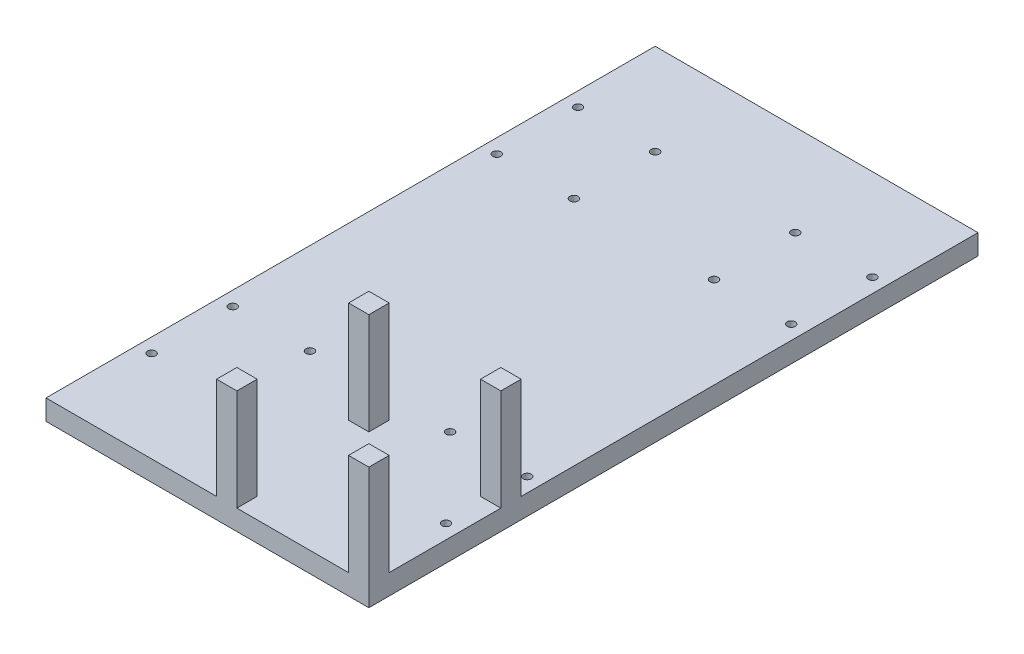
ISO-10303-21;
HEADER;
FILE_DESCRIPTION(('STEP AP214'),'2;1');
FILE_NAME('part.step','',(''),(''),'','','');
FILE_SCHEMA(('AUTOMOTIVE_DESIGN { 1 0 10303 214 1 1 1 1 }'));
ENDSEC;
DATA;
#1=APPLICATION_CONTEXT('core data for automotive mechanical design processes');
#2=APPLICATION_PROTOCOL_DEFINITION('international standard','automotive_design',2000,#1);
#3=PRODUCT_CONTEXT('',#1,'mechanical');
#4=PRODUCT('Part','Part','',(#3));
#5=PRODUCT_RELATED_PRODUCT_CATEGORY('part','',(#4));
#6=PRODUCT_DEFINITION_FORMATION('','',#4);
#7=PRODUCT_DEFINITION_CONTEXT('part definition',#1,'design');
#8=PRODUCT_DEFINITION('design','',#6,#7);
#9=PRODUCT_DEFINITION_SHAPE('','',#8);
#10=(LENGTH_UNIT() NAMED_UNIT(*) SI_UNIT(.MILLI.,.METRE.));
#11=(NAMED_UNIT(*) PLANE_ANGLE_UNIT() SI_UNIT($,.RADIAN.));
#12=(NAMED_UNIT(*) SI_UNIT($,.STERADIAN.) SOLID_ANGLE_UNIT());
#13=UNCERTAINTY_MEASURE_WITH_UNIT(LENGTH_MEASURE(1.E-05),#10,'distance_accuracy_value','');
#14=(GEOMETRIC_REPRESENTATION_CONTEXT(3) GLOBAL_UNCERTAINTY_ASSIGNED_CONTEXT((#13)) GLOBAL_UNIT_ASSIGNED_CONTEXT((#10,
#11,#12)) REPRESENTATION_CONTEXT('',''));
#15=CARTESIAN_POINT('',(0.,0.,0.));
#16=DIRECTION('',(0.,0.,1.));
#17=DIRECTION('',(1.,0.,0.));
#18=AXIS2_PLACEMENT_3D('',#15,#16,#17);
#19=CARTESIAN_POINT('',(0.,10.,0.));
#20=DIRECTION('',(0.,-1.,0.));
#21=DIRECTION('',(0.,0.,-1.));
#22=AXIS2_PLACEMENT_3D('',#19,#20,#21);
#23=PLANE('',#22);
#24=CARTESIAN_POINT('',(-72.5,10.,-65.));
#25=DIRECTION('',(0.,-1.,0.));
#26=DIRECTION('',(0.,0.,-1.));
#27=AXIS2_PLACEMENT_3D('',#24,#25,#26);
#28=CIRCLE('',#27,2.);
#29=CARTESIAN_POINT('',(-72.5,10.,-67.));
#30=VERTEX_POINT('',#29);
#31=EDGE_CURVE('E716',#30,#30,#28,.T.);
#32=ORIENTED_EDGE('',*,*,#31,.T.);
#33=EDGE_LOOP('',(#32));
#34=FACE_BOUND('',#33,.T.);
#35=CARTESIAN_POINT('',(-34.5,10.,-105.));
#36=DIRECTION('',(0.,-1.,0.));
#37=DIRECTION('',(0.,0.,-1.));
#38=AXIS2_PLACEMENT_3D('',#35,#36,#37);
#39=CIRCLE('',#38,2.);
#40=CARTESIAN_POINT('',(-34.5,10.,-107.));
#41=VERTEX_POINT('',#40);
#42=EDGE_CURVE('E721',#41,#41,#39,.T.);
#43=ORIENTED_EDGE('',*,*,#42,.T.);
#44=EDGE_LOOP('',(#43));
#45=FACE_BOUND('',#44,.T.);
#46=CARTESIAN_POINT('',(-72.5,10.,-105.));
#47=DIRECTION('',(0.,-1.,0.));
#48=DIRECTION('',(0.,0.,-1.));
#49=AXIS2_PLACEMENT_3D('',#46,#47,#48);
#50=CIRCLE('',#49,2.);
#51=CARTESIAN_POINT('',(-72.5,10.,-107.));
#52=VERTEX_POINT('',#51);
#53=EDGE_CURVE('E735',#52,#52,#50,.T.);
#54=ORIENTED_EDGE('',*,*,#53,.T.);
#55=EDGE_LOOP('',(#54));
#56=FACE_BOUND('',#55,.T.);
#57=CARTESIAN_POINT('',(-72.5,10.,64.9999999999999));
#58=DIRECTION('',(0.,-1.,0.));
#59=DIRECTION('',(0.,0.,-1.));
#60=AXIS2_PLACEMENT_3D('',#57,#58,#59);
#61=CIRCLE('',#60,2.);
#62=CARTESIAN_POINT('',(-72.5,10.,62.9999999999999));
#63=VERTEX_POINT('',#62);
#64=EDGE_CURVE('E875',#63,#63,#61,.T.);
#65=ORIENTED_EDGE('',*,*,#64,.T.);
#66=EDGE_LOOP('',(#65));
#67=FACE_BOUND('',#66,.T.);
#68=CARTESIAN_POINT('',(-34.5,10.,-65.));
#69=DIRECTION('',(0.,-1.,0.));
#70=DIRECTION('',(0.,0.,-1.));
#71=AXIS2_PLACEMENT_3D('',#68,#69,#70);
#72=CIRCLE('',#71,2.);
#73=CARTESIAN_POINT('',(-34.5,10.,-67.));
#74=VERTEX_POINT('',#73);
#75=EDGE_CURVE('E761',#74,#74,#72,.T.);
#76=ORIENTED_EDGE('',*,*,#75,.T.);
#77=EDGE_LOOP('',(#76));
#78=FACE_BOUND('',#77,.T.);
#79=CARTESIAN_POINT('',(34.5,10.,-65.));
#80=DIRECTION('',(0.,-1.,0.));
#81=DIRECTION('',(0.,0.,-1.));
#82=AXIS2_PLACEMENT_3D('',#79,#80,#81);
#83=CIRCLE('',#82,2.);
#84=CARTESIAN_POINT('',(34.5,10.,-67.));
#85=VERTEX_POINT('',#84);
#86=EDGE_CURVE('E753',#85,#85,#83,.T.);
#87=ORIENTED_EDGE('',*,*,#86,.T.);
#88=EDGE_LOOP('',(#87));
#89=FACE_BOUND('',#88,.T.);
#90=CARTESIAN_POINT('',(72.5000000000002,10.,-65.));
#91=DIRECTION('',(0.,-1.,0.));
#92=DIRECTION('',(0.,0.,-1.));
#93=AXIS2_PLACEMENT_3D('',#90,#91,#92);
#94=CIRCLE('',#93,2.);
#95=CARTESIAN_POINT('',(72.5000000000002,10.,-67.));
#96=VERTEX_POINT('',#95);
#97=EDGE_CURVE('E745',#96,#96,#94,.T.);
#98=ORIENTED_EDGE('',*,*,#97,.T.);
#99=EDGE_LOOP('',(#98));
#100=FACE_BOUND('',#99,.T.);
#101=CARTESIAN_POINT('',(72.5,10.,-105.));
#102=DIRECTION('',(0.,-1.,0.));
#103=DIRECTION('',(0.,0.,-1.));
#104=AXIS2_PLACEMENT_3D('',#101,#102,#103);
#105=CIRCLE('',#104,2.);
#106=CARTESIAN_POINT('',(72.5,10.,-107.));
#107=VERTEX_POINT('',#106);
#108=EDGE_CURVE('E736',#107,#107,#105,.T.);
#109=ORIENTED_EDGE('',*,*,#108,.T.);
#110=EDGE_LOOP('',(#109));
#111=FACE_BOUND('',#110,.T.);
#112=CARTESIAN_POINT('',(34.4999999999998,10.,65.0000000000001));
#113=DIRECTION('',(0.,-1.,0.));
#114=DIRECTION('',(0.,0.,-1.));
#115=AXIS2_PLACEMENT_3D('',#112,#113,#114);
#116=CIRCLE('',#115,2.);
#117=CARTESIAN_POINT('',(34.4999999999998,10.,63.0000000000001));
#118=VERTEX_POINT('',#117);
#119=EDGE_CURVE('E891',#118,#118,#116,.T.);
#120=ORIENTED_EDGE('',*,*,#119,.T.);
#121=EDGE_LOOP('',(#120));
#122=FACE_BOUND('',#121,.T.);
#123=CARTESIAN_POINT('',(72.5,10.,64.9999999999999));
#124=DIRECTION('',(0.,-1.,0.));
#125=DIRECTION('',(0.,0.,-1.));
#126=AXIS2_PLACEMENT_3D('',#123,#124,#125);
#127=CIRCLE('',#126,2.);
#128=CARTESIAN_POINT('',(72.5,10.,62.9999999999999));
#129=VERTEX_POINT('',#128);
#130=EDGE_CURVE('E897',#129,#129,#127,.T.);
#131=ORIENTED_EDGE('',*,*,#130,.T.);
#132=EDGE_LOOP('',(#131));
#133=FACE_BOUND('',#132,.T.);
#134=CARTESIAN_POINT('',(72.5,10.,105.000000000001));
#135=DIRECTION('',(0.,-1.,0.));
#136=DIRECTION('',(0.,0.,-1.));
#137=AXIS2_PLACEMENT_3D('',#134,#135,#136);
#138=CIRCLE('',#137,2.);
#139=CARTESIAN_POINT('',(72.5,10.,103.000000000001));
#140=VERTEX_POINT('',#139);
#141=EDGE_CURVE('E844',#140,#140,#138,.T.);
#142=ORIENTED_EDGE('',*,*,#141,.T.);
#143=EDGE_LOOP('',(#142));
#144=FACE_BOUND('',#143,.T.);
#145=CARTESIAN_POINT('',(-72.5,10.,105.));
#146=DIRECTION('',(0.,-1.,0.));
#147=DIRECTION('',(0.,0.,-1.));
#148=AXIS2_PLACEMENT_3D('',#145,#146,#147);
#149=CIRCLE('',#148,2.);
#150=CARTESIAN_POINT('',(-72.5,10.,103.));
#151=VERTEX_POINT('',#150);
#152=EDGE_CURVE('E854',#151,#151,#149,.T.);
#153=ORIENTED_EDGE('',*,*,#152,.T.);
#154=EDGE_LOOP('',(#153));
#155=FACE_BOUND('',#154,.T.);
#156=CARTESIAN_POINT('',(-34.5,10.,105.));
#157=DIRECTION('',(0.,-1.,0.));
#158=DIRECTION('',(0.,0.,-1.));
#159=AXIS2_PLACEMENT_3D('',#156,#157,#158);
#160=CIRCLE('',#159,2.00000000591263);
#161=CARTESIAN_POINT('',(-34.5,10.,102.999999994087));
#162=VERTEX_POINT('',#161);
#163=EDGE_CURVE('E861',#162,#162,#160,.T.);
#164=ORIENTED_EDGE('',*,*,#163,.T.);
#165=EDGE_LOOP('',(#164));
#166=FACE_BOUND('',#165,.T.);
#167=CARTESIAN_POINT('',(-34.5,10.,65.));
#168=DIRECTION('',(0.,-1.,0.));
#169=DIRECTION('',(0.,0.,-1.));
#170=AXIS2_PLACEMENT_3D('',#167,#168,#169);
#171=CIRCLE('',#170,2.);
#172=CARTESIAN_POINT('',(-34.5,10.,63.));
#173=VERTEX_POINT('',#172);
#174=EDGE_CURVE('E867',#173,#173,#171,.T.);
#175=ORIENTED_EDGE('',*,*,#174,.T.);
#176=EDGE_LOOP('',(#175));
#177=FACE_BOUND('',#176,.T.);
#178=CARTESIAN_POINT('',(34.5,10.,105.));
#179=DIRECTION('',(0.,-1.,0.));
#180=DIRECTION('',(0.,0.,-1.));
#181=AXIS2_PLACEMENT_3D('',#178,#179,#180);
#182=CIRCLE('',#181,1.99999999408737);
#183=CARTESIAN_POINT('',(34.5,10.,103.000000005913));
#184=VERTEX_POINT('',#183);
#185=EDGE_CURVE('E843',#184,#184,#182,.T.);
#186=ORIENTED_EDGE('',*,*,#185,.T.);
#187=EDGE_LOOP('',(#186));
#188=FACE_BOUND('',#187,.T.);
#189=CARTESIAN_POINT('',(34.5,10.,-105.));
#190=DIRECTION('',(0.,-1.,0.));
#191=DIRECTION('',(0.,0.,-1.));
#192=AXIS2_PLACEMENT_3D('',#189,#190,#191);
#193=CIRCLE('',#192,2.);
#194=CARTESIAN_POINT('',(34.5,10.,-107.));
#195=VERTEX_POINT('',#194);
#196=EDGE_CURVE('E768',#195,#195,#193,.T.);
#197=ORIENTED_EDGE('',*,*,#196,.T.);
#198=EDGE_LOOP('',(#197));
#199=FACE_BOUND('',#198,.T.);
#200=DIRECTION('',(0.,0.,1.));
#201=VECTOR('',#200,1.);
#202=CARTESIAN_POINT('',(4.49999999999999,10.,85.));
#203=LINE('',#202,#201);
#204=CARTESIAN_POINT('',(4.49999999999999,10.,75.));
#205=VERTEX_POINT('',#204);
#206=CARTESIAN_POINT('',(4.49999999999999,10.,85.));
#207=VERTEX_POINT('',#206);
#208=EDGE_CURVE('E243',#205,#207,#203,.T.);
#209=ORIENTED_EDGE('',*,*,#208,.F.);
#210=DIRECTION('',(-1.,0.,0.));
#211=VECTOR('',#210,1.);
#212=CARTESIAN_POINT('',(14.5,10.,75.));
#213=LINE('',#212,#211);
#214=CARTESIAN_POINT('',(14.5,10.,75.));
#215=VERTEX_POINT('',#214);
#216=EDGE_CURVE('E249',#215,#205,#213,.T.);
#217=ORIENTED_EDGE('',*,*,#216,.F.);
#218=DIRECTION('',(0.,0.,-1.));
#219=VECTOR('',#218,1.);
#220=CARTESIAN_POINT('',(14.5,10.,85.));
#221=LINE('',#220,#219);
#222=CARTESIAN_POINT('',(14.5,10.,85.));
#223=VERTEX_POINT('',#222);
#224=EDGE_CURVE('E266',#223,#215,#221,.T.);
#225=ORIENTED_EDGE('',*,*,#224,.F.);
#226=DIRECTION('',(1.,0.,0.));
#227=VECTOR('',#226,1.);
#228=CARTESIAN_POINT('',(4.49999999999999,10.,85.));
#229=LINE('',#228,#227);
#230=EDGE_CURVE('E262',#207,#223,#229,.T.);
#231=ORIENTED_EDGE('',*,*,#230,.F.);
#232=EDGE_LOOP('',(#209,#217,#225,#231));
#233=FACE_BOUND('',#232,.T.);
#234=DIRECTION('',(0.,0.,-1.));
#235=VECTOR('',#234,1.);
#236=CARTESIAN_POINT('',(14.5,10.,150.));
#237=LINE('',#236,#235);
#238=CARTESIAN_POINT('',(14.5,10.,150.));
#239=VERTEX_POINT('',#238);
#240=CARTESIAN_POINT('',(14.5,10.,140.));
#241=VERTEX_POINT('',#240);
#242=EDGE_CURVE('E772',#239,#241,#237,.T.);
#243=ORIENTED_EDGE('',*,*,#242,.F.);
#244=DIRECTION('',(1.,0.,0.));
#245=VECTOR('',#244,1.);
#246=CARTESIAN_POINT('',(-79.5,10.,150.));
#247=LINE('',#246,#245);
#248=CARTESIAN_POINT('',(69.5,10.,150.));
#249=VERTEX_POINT('',#248);
#250=EDGE_CURVE('E194',#239,#249,#247,.T.);
#251=ORIENTED_EDGE('',*,*,#250,.T.);
#252=DIRECTION('',(0.,0.,1.));
#253=VECTOR('',#252,1.);
#254=CARTESIAN_POINT('',(69.5,10.,140.));
#255=LINE('',#254,#253);
#256=CARTESIAN_POINT('',(69.5,10.,140.));
#257=VERTEX_POINT('',#256);
#258=EDGE_CURVE('E294',#257,#249,#255,.T.);
#259=ORIENTED_EDGE('',*,*,#258,.F.);
#260=DIRECTION('',(-1.,0.,0.));
#261=VECTOR('',#260,1.);
#262=CARTESIAN_POINT('',(69.5,10.,140.));
#263=LINE('',#262,#261);
#264=CARTESIAN_POINT('',(79.5,10.,140.));
#265=VERTEX_POINT('',#264);
#266=EDGE_CURVE('E288',#265,#257,#263,.T.);
#267=ORIENTED_EDGE('',*,*,#266,.F.);
#268=DIRECTION('',(0.,0.,-1.));
#269=VECTOR('',#268,1.);
#270=CARTESIAN_POINT('',(79.5,10.,150.));
#271=LINE('',#270,#269);
#272=CARTESIAN_POINT('',(79.5,10.,85.));
#273=VERTEX_POINT('',#272);
#274=EDGE_CURVE('E322',#265,#273,#271,.T.);
#275=ORIENTED_EDGE('',*,*,#274,.T.);
#276=DIRECTION('',(1.,0.,0.));
#277=VECTOR('',#276,1.);
#278=CARTESIAN_POINT('',(69.5,10.,85.));
#279=LINE('',#278,#277);
#280=CARTESIAN_POINT('',(69.5,10.,85.));
#281=VERTEX_POINT('',#280);
#282=EDGE_CURVE('E212',#281,#273,#279,.T.);
#283=ORIENTED_EDGE('',*,*,#282,.F.);
#284=DIRECTION('',(0.,0.,1.));
#285=VECTOR('',#284,1.);
#286=CARTESIAN_POINT('',(69.5,10.,75.));
#287=LINE('',#286,#285);
#288=CARTESIAN_POINT('',(69.5,10.,75.));
#289=VERTEX_POINT('',#288);
#290=EDGE_CURVE('E201',#289,#281,#287,.T.);
#291=ORIENTED_EDGE('',*,*,#290,.F.);
#292=DIRECTION('',(-1.,0.,0.));
#293=VECTOR('',#292,1.);
#294=CARTESIAN_POINT('',(79.5,10.,75.));
#295=LINE('',#294,#293);
#296=CARTESIAN_POINT('',(79.5,10.,75.));
#297=VERTEX_POINT('',#296);
#298=EDGE_CURVE('E196',#297,#289,#295,.T.);
#299=ORIENTED_EDGE('',*,*,#298,.F.);
#300=CARTESIAN_POINT('',(79.5,10.,-150.));
#301=VERTEX_POINT('',#300);
#302=EDGE_CURVE('E326',#297,#301,#271,.T.);
#303=ORIENTED_EDGE('',*,*,#302,.T.);
#304=DIRECTION('',(-1.,0.,0.));
#305=VECTOR('',#304,1.);
#306=CARTESIAN_POINT('',(-79.5,10.,-150.));
#307=LINE('',#306,#305);
#308=CARTESIAN_POINT('',(-79.5,10.,-150.));
#309=VERTEX_POINT('',#308);
#310=EDGE_CURVE('E325',#301,#309,#307,.T.);
#311=ORIENTED_EDGE('',*,*,#310,.T.);
#312=DIRECTION('',(0.,0.,1.));
#313=VECTOR('',#312,1.);
#314=CARTESIAN_POINT('',(-79.5,10.,150.));
#315=LINE('',#314,#313);
#316=CARTESIAN_POINT('',(-79.5,10.,150.));
#317=VERTEX_POINT('',#316);
#318=EDGE_CURVE('E329',#309,#317,#315,.T.);
#319=ORIENTED_EDGE('',*,*,#318,.T.);
#320=CARTESIAN_POINT('',(4.49999999999996,10.,150.));
#321=VERTEX_POINT('',#320);
#322=EDGE_CURVE('E332',#317,#321,#247,.T.);
#323=ORIENTED_EDGE('',*,*,#322,.T.);
#324=DIRECTION('',(0.,0.,1.));
#325=VECTOR('',#324,1.);
#326=CARTESIAN_POINT('',(4.49999999999999,10.,150.));
#327=LINE('',#326,#325);
#328=CARTESIAN_POINT('',(4.49999999999999,10.,140.));
#329=VERTEX_POINT('',#328);
#330=EDGE_CURVE('E60',#329,#321,#327,.T.);
#331=ORIENTED_EDGE('',*,*,#330,.F.);
#332=DIRECTION('',(-1.,0.,0.));
#333=VECTOR('',#332,1.);
#334=CARTESIAN_POINT('',(4.49999999999999,10.,140.));
#335=LINE('',#334,#333);
#336=EDGE_CURVE('E55',#241,#329,#335,.T.);
#337=ORIENTED_EDGE('',*,*,#336,.F.);
#338=EDGE_LOOP('',(#243,#251,#259,#267,#275,#283,#291,#299,#303,#311,#319,#323,#331,#337));
#339=FACE_BOUND('',#338,.T.);
#340=ADVANCED_FACE('F39',(#34,#45,#56,#67,#78,#89,#100,#111,#122,#133,#144,#155,#166,#177,#188,
#199,#233,#339),#23,.F.);
#341=CARTESIAN_POINT('',(79.5,10.,150.));
#342=DIRECTION('',(-1.,0.,0.));
#343=DIRECTION('',(0.,0.,1.));
#344=AXIS2_PLACEMENT_3D('',#341,#342,#343);
#345=PLANE('',#344);
#346=DIRECTION('',(0.,0.,-1.));
#347=VECTOR('',#346,1.);
#348=CARTESIAN_POINT('',(79.5,0.,150.));
#349=LINE('',#348,#347);
#350=CARTESIAN_POINT('',(79.5,0.,150.));
#351=VERTEX_POINT('',#350);
#352=CARTESIAN_POINT('',(79.5,0.,-150.));
#353=VERTEX_POINT('',#352);
#354=EDGE_CURVE('E321',#351,#353,#349,.T.);
#355=ORIENTED_EDGE('',*,*,#354,.T.);
#356=DIRECTION('',(0.,-1.,0.));
#357=VECTOR('',#356,1.);
#358=CARTESIAN_POINT('',(79.5,10.,-150.));
#359=LINE('',#358,#357);
#360=EDGE_CURVE('E11',#301,#353,#359,.T.);
#361=ORIENTED_EDGE('',*,*,#360,.F.);
#362=ORIENTED_EDGE('',*,*,#302,.F.);
#363=DIRECTION('',(0.,-1.,0.));
#364=VECTOR('',#363,1.);
#365=CARTESIAN_POINT('',(79.5,60.,75.));
#366=LINE('',#365,#364);
#367=CARTESIAN_POINT('',(79.5,60.,75.));
#368=VERTEX_POINT('',#367);
#369=EDGE_CURVE('E239',#368,#297,#366,.T.);
#370=ORIENTED_EDGE('',*,*,#369,.F.);
#371=DIRECTION('',(0.,0.,-1.));
#372=VECTOR('',#371,1.);
#373=CARTESIAN_POINT('',(79.5,60.,85.));
#374=LINE('',#373,#372);
#375=CARTESIAN_POINT('',(79.5,60.,85.));
#376=VERTEX_POINT('',#375);
#377=EDGE_CURVE('E207',#376,#368,#374,.T.);
#378=ORIENTED_EDGE('',*,*,#377,.F.);
#379=DIRECTION('',(0.,-1.,0.));
#380=VECTOR('',#379,1.);
#381=CARTESIAN_POINT('',(79.5,60.,85.));
#382=LINE('',#381,#380);
#383=EDGE_CURVE('E220',#376,#273,#382,.T.);
#384=ORIENTED_EDGE('',*,*,#383,.T.);
#385=ORIENTED_EDGE('',*,*,#274,.F.);
#386=DIRECTION('',(0.,-1.,0.));
#387=VECTOR('',#386,1.);
#388=CARTESIAN_POINT('',(79.5,60.,140.));
#389=LINE('',#388,#387);
#390=CARTESIAN_POINT('',(79.5,60.,140.));
#391=VERTEX_POINT('',#390);
#392=EDGE_CURVE('E317',#391,#265,#389,.T.);
#393=ORIENTED_EDGE('',*,*,#392,.F.);
#394=DIRECTION('',(0.,0.,-1.));
#395=VECTOR('',#394,1.);
#396=CARTESIAN_POINT('',(79.5,60.,150.));
#397=LINE('',#396,#395);
#398=CARTESIAN_POINT('',(79.5,60.,150.));
#399=VERTEX_POINT('',#398);
#400=EDGE_CURVE('E289',#399,#391,#397,.T.);
#401=ORIENTED_EDGE('',*,*,#400,.F.);
#402=DIRECTION('',(0.,-1.,0.));
#403=VECTOR('',#402,1.);
#404=CARTESIAN_POINT('',(79.5,10.,150.));
#405=LINE('',#404,#403);
#406=EDGE_CURVE('E335',#399,#351,#405,.T.);
#407=ORIENTED_EDGE('',*,*,#406,.T.);
#408=EDGE_LOOP('',(#355,#361,#362,#370,#378,#384,#385,#393,#401,#407));
#409=FACE_BOUND('',#408,.T.);
#410=ADVANCED_FACE('F41',(#409),#345,.F.);
#411=CARTESIAN_POINT('',(-79.5,10.,-150.));
#412=DIRECTION('',(0.,0.,1.));
#413=DIRECTION('',(1.,0.,0.));
#414=AXIS2_PLACEMENT_3D('',#411,#412,#413);
#415=PLANE('',#414);
#416=DIRECTION('',(-1.,0.,0.));
#417=VECTOR('',#416,1.);
#418=CARTESIAN_POINT('',(-79.5,0.,-150.));
#419=LINE('',#418,#417);
#420=CARTESIAN_POINT('',(-79.5,0.,-150.));
#421=VERTEX_POINT('',#420);
#422=EDGE_CURVE('E339',#353,#421,#419,.T.);
#423=ORIENTED_EDGE('',*,*,#422,.T.);
#424=DIRECTION('',(0.,-1.,0.));
#425=VECTOR('',#424,1.);
#426=CARTESIAN_POINT('',(-79.5,10.,-150.));
#427=LINE('',#426,#425);
#428=EDGE_CURVE('E48',#309,#421,#427,.T.);
#429=ORIENTED_EDGE('',*,*,#428,.F.);
#430=ORIENTED_EDGE('',*,*,#310,.F.);
#431=ORIENTED_EDGE('',*,*,#360,.T.);
#432=EDGE_LOOP('',(#423,#429,#430,#431));
#433=FACE_BOUND('',#432,.T.);
#434=ADVANCED_FACE('F399',(#433),#415,.F.);
#435=CARTESIAN_POINT('',(-79.5,10.,150.));
#436=DIRECTION('',(1.,0.,0.));
#437=DIRECTION('',(0.,0.,-1.));
#438=AXIS2_PLACEMENT_3D('',#435,#436,#437);
#439=PLANE('',#438);
#440=DIRECTION('',(0.,0.,1.));
#441=VECTOR('',#440,1.);
#442=CARTESIAN_POINT('',(-79.5,0.,150.));
#443=LINE('',#442,#441);
#444=CARTESIAN_POINT('',(-79.5,0.,150.));
#445=VERTEX_POINT('',#444);
#446=EDGE_CURVE('E342',#421,#445,#443,.T.);
#447=ORIENTED_EDGE('',*,*,#446,.T.);
#448=DIRECTION('',(0.,-1.,0.));
#449=VECTOR('',#448,1.);
#450=CARTESIAN_POINT('',(-79.5,10.,150.));
#451=LINE('',#450,#449);
#452=EDGE_CURVE('E351',#317,#445,#451,.T.);
#453=ORIENTED_EDGE('',*,*,#452,.F.);
#454=ORIENTED_EDGE('',*,*,#318,.F.);
#455=ORIENTED_EDGE('',*,*,#428,.T.);
#456=EDGE_LOOP('',(#447,#453,#454,#455));
#457=FACE_BOUND('',#456,.T.);
#458=ADVANCED_FACE('F360',(#457),#439,.F.);
#459=CARTESIAN_POINT('',(-79.5,10.,150.));
#460=DIRECTION('',(0.,0.,-1.));
#461=DIRECTION('',(-1.,0.,0.));
#462=AXIS2_PLACEMENT_3D('',#459,#460,#461);
#463=PLANE('',#462);
#464=DIRECTION('',(1.,0.,0.));
#465=VECTOR('',#464,1.);
#466=CARTESIAN_POINT('',(-79.5,0.,150.));
#467=LINE('',#466,#465);
#468=EDGE_CURVE('E345',#445,#351,#467,.T.);
#469=ORIENTED_EDGE('',*,*,#468,.T.);
#470=ORIENTED_EDGE('',*,*,#406,.F.);
#471=DIRECTION('',(1.,0.,0.));
#472=VECTOR('',#471,1.);
#473=CARTESIAN_POINT('',(79.5,60.,150.));
#474=LINE('',#473,#472);
#475=CARTESIAN_POINT('',(69.5,60.,150.));
#476=VERTEX_POINT('',#475);
#477=EDGE_CURVE('E300',#476,#399,#474,.T.);
#478=ORIENTED_EDGE('',*,*,#477,.F.);
#479=DIRECTION('',(0.,-1.,0.));
#480=VECTOR('',#479,1.);
#481=CARTESIAN_POINT('',(69.5,60.,150.));
#482=LINE('',#481,#480);
#483=EDGE_CURVE('E304',#476,#249,#482,.T.);
#484=ORIENTED_EDGE('',*,*,#483,.T.);
#485=ORIENTED_EDGE('',*,*,#250,.F.);
#486=DIRECTION('',(0.,-1.,0.));
#487=VECTOR('',#486,1.);
#488=CARTESIAN_POINT('',(14.5,60.,150.));
#489=LINE('',#488,#487);
#490=CARTESIAN_POINT('',(14.5,60.,150.));
#491=VERTEX_POINT('',#490);
#492=EDGE_CURVE('E174',#491,#239,#489,.T.);
#493=ORIENTED_EDGE('',*,*,#492,.F.);
#494=DIRECTION('',(1.,0.,0.));
#495=VECTOR('',#494,1.);
#496=CARTESIAN_POINT('',(14.5,60.,150.));
#497=LINE('',#496,#495);
#498=CARTESIAN_POINT('',(4.49999999999999,60.,150.));
#499=VERTEX_POINT('',#498);
#500=EDGE_CURVE('E181',#499,#491,#497,.T.);
#501=ORIENTED_EDGE('',*,*,#500,.F.);
#502=DIRECTION('',(0.,-1.,0.));
#503=VECTOR('',#502,1.);
#504=CARTESIAN_POINT('',(4.49999999999999,60.,150.));
#505=LINE('',#504,#503);
#506=EDGE_CURVE('E780',#499,#321,#505,.T.);
#507=ORIENTED_EDGE('',*,*,#506,.T.);
#508=ORIENTED_EDGE('',*,*,#322,.F.);
#509=ORIENTED_EDGE('',*,*,#452,.T.);
#510=EDGE_LOOP('',(#469,#470,#478,#484,#485,#493,#501,#507,#508,#509));
#511=FACE_BOUND('',#510,.T.);
#512=ADVANCED_FACE('F192',(#511),#463,.F.);
#513=CARTESIAN_POINT('',(0.,0.,0.));
#514=DIRECTION('',(0.,-1.,0.));
#515=DIRECTION('',(0.,0.,-1.));
#516=AXIS2_PLACEMENT_3D('',#513,#514,#515);
#517=PLANE('',#516);
#518=CARTESIAN_POINT('',(-72.5,0.,-65.));
#519=DIRECTION('',(0.,-1.,0.));
#520=DIRECTION('',(0.,0.,-1.));
#521=AXIS2_PLACEMENT_3D('',#518,#519,#520);
#522=CIRCLE('',#521,2.);
#523=CARTESIAN_POINT('',(-72.5,0.,-67.));
#524=VERTEX_POINT('',#523);
#525=EDGE_CURVE('E719',#524,#524,#522,.T.);
#526=ORIENTED_EDGE('',*,*,#525,.F.);
#527=EDGE_LOOP('',(#526));
#528=FACE_BOUND('',#527,.T.);
#529=CARTESIAN_POINT('',(-34.5,0.,-105.));
#530=DIRECTION('',(0.,-1.,0.));
#531=DIRECTION('',(0.,0.,-1.));
#532=AXIS2_PLACEMENT_3D('',#529,#530,#531);
#533=CIRCLE('',#532,2.);
#534=CARTESIAN_POINT('',(-34.5,0.,-107.));
#535=VERTEX_POINT('',#534);
#536=EDGE_CURVE('E728',#535,#535,#533,.T.);
#537=ORIENTED_EDGE('',*,*,#536,.F.);
#538=EDGE_LOOP('',(#537));
#539=FACE_BOUND('',#538,.T.);
#540=CARTESIAN_POINT('',(-72.5,0.,-105.));
#541=DIRECTION('',(0.,-1.,0.));
#542=DIRECTION('',(0.,0.,-1.));
#543=AXIS2_PLACEMENT_3D('',#540,#541,#542);
#544=CIRCLE('',#543,2.);
#545=CARTESIAN_POINT('',(-72.5,0.,-107.));
#546=VERTEX_POINT('',#545);
#547=EDGE_CURVE('E871',#546,#546,#544,.T.);
#548=ORIENTED_EDGE('',*,*,#547,.F.);
#549=EDGE_LOOP('',(#548));
#550=FACE_BOUND('',#549,.T.);
#551=CARTESIAN_POINT('',(-72.5,0.,64.9999999999999));
#552=DIRECTION('',(0.,-1.,0.));
#553=DIRECTION('',(0.,0.,-1.));
#554=AXIS2_PLACEMENT_3D('',#551,#552,#553);
#555=CIRCLE('',#554,2.);
#556=CARTESIAN_POINT('',(-72.5,0.,62.9999999999999));
#557=VERTEX_POINT('',#556);
#558=EDGE_CURVE('E858',#557,#557,#555,.T.);
#559=ORIENTED_EDGE('',*,*,#558,.F.);
#560=EDGE_LOOP('',(#559));
#561=FACE_BOUND('',#560,.T.);
#562=CARTESIAN_POINT('',(-34.5,0.,-65.));
#563=DIRECTION('',(0.,-1.,0.));
#564=DIRECTION('',(0.,0.,-1.));
#565=AXIS2_PLACEMENT_3D('',#562,#563,#564);
#566=CIRCLE('',#565,2.);
#567=CARTESIAN_POINT('',(-34.5,0.,-67.));
#568=VERTEX_POINT('',#567);
#569=EDGE_CURVE('E725',#568,#568,#566,.T.);
#570=ORIENTED_EDGE('',*,*,#569,.F.);
#571=EDGE_LOOP('',(#570));
#572=FACE_BOUND('',#571,.T.);
#573=CARTESIAN_POINT('',(34.5,0.,-65.));
#574=DIRECTION('',(0.,-1.,0.));
#575=DIRECTION('',(0.,0.,-1.));
#576=AXIS2_PLACEMENT_3D('',#573,#574,#575);
#577=CIRCLE('',#576,2.);
#578=CARTESIAN_POINT('',(34.5,0.,-67.));
#579=VERTEX_POINT('',#578);
#580=EDGE_CURVE('E757',#579,#579,#577,.T.);
#581=ORIENTED_EDGE('',*,*,#580,.F.);
#582=EDGE_LOOP('',(#581));
#583=FACE_BOUND('',#582,.T.);
#584=CARTESIAN_POINT('',(72.5000000000002,0.,-65.));
#585=DIRECTION('',(0.,-1.,0.));
#586=DIRECTION('',(0.,0.,-1.));
#587=AXIS2_PLACEMENT_3D('',#584,#585,#586);
#588=CIRCLE('',#587,2.);
#589=CARTESIAN_POINT('',(72.5000000000002,0.,-67.));
#590=VERTEX_POINT('',#589);
#591=EDGE_CURVE('E749',#590,#590,#588,.T.);
#592=ORIENTED_EDGE('',*,*,#591,.F.);
#593=EDGE_LOOP('',(#592));
#594=FACE_BOUND('',#593,.T.);
#595=CARTESIAN_POINT('',(72.5,0.,-105.));
#596=DIRECTION('',(0.,-1.,0.));
#597=DIRECTION('',(0.,0.,-1.));
#598=AXIS2_PLACEMENT_3D('',#595,#596,#597);
#599=CIRCLE('',#598,2.);
#600=CARTESIAN_POINT('',(72.5,0.,-107.));
#601=VERTEX_POINT('',#600);
#602=EDGE_CURVE('E741',#601,#601,#599,.T.);
#603=ORIENTED_EDGE('',*,*,#602,.F.);
#604=EDGE_LOOP('',(#603));
#605=FACE_BOUND('',#604,.T.);
#606=CARTESIAN_POINT('',(34.4999999999998,0.,65.0000000000001));
#607=DIRECTION('',(0.,-1.,0.));
#608=DIRECTION('',(0.,0.,-1.));
#609=AXIS2_PLACEMENT_3D('',#606,#607,#608);
#610=CIRCLE('',#609,2.);
#611=CARTESIAN_POINT('',(34.4999999999998,0.,63.0000000000001));
#612=VERTEX_POINT('',#611);
#613=EDGE_CURVE('E817',#612,#612,#610,.T.);
#614=ORIENTED_EDGE('',*,*,#613,.F.);
#615=EDGE_LOOP('',(#614));
#616=FACE_BOUND('',#615,.T.);
#617=CARTESIAN_POINT('',(72.5,0.,64.9999999999999));
#618=DIRECTION('',(0.,-1.,0.));
#619=DIRECTION('',(0.,0.,-1.));
#620=AXIS2_PLACEMENT_3D('',#617,#618,#619);
#621=CIRCLE('',#620,2.);
#622=CARTESIAN_POINT('',(72.5,0.,62.9999999999999));
#623=VERTEX_POINT('',#622);
#624=EDGE_CURVE('E821',#623,#623,#621,.T.);
#625=ORIENTED_EDGE('',*,*,#624,.F.);
#626=EDGE_LOOP('',(#625));
#627=FACE_BOUND('',#626,.T.);
#628=CARTESIAN_POINT('',(72.5,0.,105.000000000001));
#629=DIRECTION('',(0.,-1.,0.));
#630=DIRECTION('',(0.,0.,-1.));
#631=AXIS2_PLACEMENT_3D('',#628,#629,#630);
#632=CIRCLE('',#631,2.);
#633=CARTESIAN_POINT('',(72.5,0.,103.000000000001));
#634=VERTEX_POINT('',#633);
#635=EDGE_CURVE('E825',#634,#634,#632,.T.);
#636=ORIENTED_EDGE('',*,*,#635,.F.);
#637=EDGE_LOOP('',(#636));
#638=FACE_BOUND('',#637,.T.);
#639=CARTESIAN_POINT('',(-72.5,0.,105.));
#640=DIRECTION('',(0.,-1.,0.));
#641=DIRECTION('',(0.,0.,-1.));
#642=AXIS2_PLACEMENT_3D('',#639,#640,#641);
#643=CIRCLE('',#642,2.);
#644=CARTESIAN_POINT('',(-72.5,0.,103.));
#645=VERTEX_POINT('',#644);
#646=EDGE_CURVE('E829',#645,#645,#643,.T.);
#647=ORIENTED_EDGE('',*,*,#646,.F.);
#648=EDGE_LOOP('',(#647));
#649=FACE_BOUND('',#648,.T.);
#650=CARTESIAN_POINT('',(-34.5,0.,105.));
#651=DIRECTION('',(0.,-1.,0.));
#652=DIRECTION('',(0.,0.,-1.));
#653=AXIS2_PLACEMENT_3D('',#650,#651,#652);
#654=CIRCLE('',#653,2.00000000591263);
#655=CARTESIAN_POINT('',(-34.5,0.,102.999999994087));
#656=VERTEX_POINT('',#655);
#657=EDGE_CURVE('E833',#656,#656,#654,.T.);
#658=ORIENTED_EDGE('',*,*,#657,.F.);
#659=EDGE_LOOP('',(#658));
#660=FACE_BOUND('',#659,.T.);
#661=CARTESIAN_POINT('',(-34.5,0.,65.));
#662=DIRECTION('',(0.,-1.,0.));
#663=DIRECTION('',(0.,0.,-1.));
#664=AXIS2_PLACEMENT_3D('',#661,#662,#663);
#665=CIRCLE('',#664,2.);
#666=CARTESIAN_POINT('',(-34.5,0.,63.));
#667=VERTEX_POINT('',#666);
#668=EDGE_CURVE('E837',#667,#667,#665,.T.);
#669=ORIENTED_EDGE('',*,*,#668,.F.);
#670=EDGE_LOOP('',(#669));
#671=FACE_BOUND('',#670,.T.);
#672=CARTESIAN_POINT('',(34.5,0.,105.));
#673=DIRECTION('',(0.,-1.,0.));
#674=DIRECTION('',(0.,0.,-1.));
#675=AXIS2_PLACEMENT_3D('',#672,#673,#674);
#676=CIRCLE('',#675,1.99999999408737);
#677=CARTESIAN_POINT('',(34.5,0.,103.000000005913));
#678=VERTEX_POINT('',#677);
#679=EDGE_CURVE('E840',#678,#678,#676,.T.);
#680=ORIENTED_EDGE('',*,*,#679,.F.);
#681=EDGE_LOOP('',(#680));
#682=FACE_BOUND('',#681,.T.);
#683=CARTESIAN_POINT('',(34.5,0.,-105.));
#684=DIRECTION('',(0.,-1.,0.));
#685=DIRECTION('',(0.,0.,-1.));
#686=AXIS2_PLACEMENT_3D('',#683,#684,#685);
#687=CIRCLE('',#686,2.);
#688=CARTESIAN_POINT('',(34.5,0.,-107.));
#689=VERTEX_POINT('',#688);
#690=EDGE_CURVE('E740',#689,#689,#687,.T.);
#691=ORIENTED_EDGE('',*,*,#690,.F.);
#692=EDGE_LOOP('',(#691));
#693=FACE_BOUND('',#692,.T.);
#694=ORIENTED_EDGE('',*,*,#354,.F.);
#695=ORIENTED_EDGE('',*,*,#468,.F.);
#696=ORIENTED_EDGE('',*,*,#446,.F.);
#697=ORIENTED_EDGE('',*,*,#422,.F.);
#698=EDGE_LOOP('',(#694,#695,#696,#697));
#699=FACE_BOUND('',#698,.T.);
#700=ADVANCED_FACE('F367',(#528,#539,#550,#561,#572,#583,#594,#605,#616,#627,#638,#649,#660,
#671,#682,#693,#699),#517,.T.);
#701=CARTESIAN_POINT('',(69.5,60.,140.));
#702=DIRECTION('',(0.,0.,1.));
#703=DIRECTION('',(1.,0.,0.));
#704=AXIS2_PLACEMENT_3D('',#701,#702,#703);
#705=PLANE('',#704);
#706=ORIENTED_EDGE('',*,*,#266,.T.);
#707=DIRECTION('',(0.,-1.,0.));
#708=VECTOR('',#707,1.);
#709=CARTESIAN_POINT('',(69.5,60.,140.));
#710=LINE('',#709,#708);
#711=CARTESIAN_POINT('',(69.5,60.,140.));
#712=VERTEX_POINT('',#711);
#713=EDGE_CURVE('E313',#712,#257,#710,.T.);
#714=ORIENTED_EDGE('',*,*,#713,.F.);
#715=DIRECTION('',(-1.,0.,0.));
#716=VECTOR('',#715,1.);
#717=CARTESIAN_POINT('',(69.5,60.,140.));
#718=LINE('',#717,#716);
#719=EDGE_CURVE('E293',#391,#712,#718,.T.);
#720=ORIENTED_EDGE('',*,*,#719,.F.);
#721=ORIENTED_EDGE('',*,*,#392,.T.);
#722=EDGE_LOOP('',(#706,#714,#720,#721));
#723=FACE_BOUND('',#722,.T.);
#724=ADVANCED_FACE('F383',(#723),#705,.F.);
#725=CARTESIAN_POINT('',(69.5,60.,140.));
#726=DIRECTION('',(1.,0.,0.));
#727=DIRECTION('',(0.,0.,-1.));
#728=AXIS2_PLACEMENT_3D('',#725,#726,#727);
#729=PLANE('',#728);
#730=ORIENTED_EDGE('',*,*,#258,.T.);
#731=ORIENTED_EDGE('',*,*,#483,.F.);
#732=DIRECTION('',(0.,0.,1.));
#733=VECTOR('',#732,1.);
#734=CARTESIAN_POINT('',(69.5,60.,140.));
#735=LINE('',#734,#733);
#736=EDGE_CURVE('E297',#712,#476,#735,.T.);
#737=ORIENTED_EDGE('',*,*,#736,.F.);
#738=ORIENTED_EDGE('',*,*,#713,.T.);
#739=EDGE_LOOP('',(#730,#731,#737,#738));
#740=FACE_BOUND('',#739,.T.);
#741=ADVANCED_FACE('F381',(#740),#729,.F.);
#742=CARTESIAN_POINT('',(0.,60.,0.));
#743=DIRECTION('',(0.,-1.,0.));
#744=DIRECTION('',(0.,0.,-1.));
#745=AXIS2_PLACEMENT_3D('',#742,#743,#744);
#746=PLANE('',#745);
#747=ORIENTED_EDGE('',*,*,#400,.T.);
#748=ORIENTED_EDGE('',*,*,#719,.T.);
#749=ORIENTED_EDGE('',*,*,#736,.T.);
#750=ORIENTED_EDGE('',*,*,#477,.T.);
#751=EDGE_LOOP('',(#747,#748,#749,#750));
#752=FACE_BOUND('',#751,.T.);
#753=ADVANCED_FACE('F376',(#752),#746,.F.);
#754=CARTESIAN_POINT('',(4.49999999999999,60.,85.));
#755=DIRECTION('',(1.,0.,0.));
#756=DIRECTION('',(0.,0.,-1.));
#757=AXIS2_PLACEMENT_3D('',#754,#755,#756);
#758=PLANE('',#757);
#759=ORIENTED_EDGE('',*,*,#208,.T.);
#760=DIRECTION('',(0.,-1.,0.));
#761=VECTOR('',#760,1.);
#762=CARTESIAN_POINT('',(4.49999999999999,60.,85.));
#763=LINE('',#762,#761);
#764=CARTESIAN_POINT('',(4.49999999999999,60.,85.));
#765=VERTEX_POINT('',#764);
#766=EDGE_CURVE('E284',#765,#207,#763,.T.);
#767=ORIENTED_EDGE('',*,*,#766,.F.);
#768=DIRECTION('',(0.,0.,1.));
#769=VECTOR('',#768,1.);
#770=CARTESIAN_POINT('',(4.49999999999999,60.,85.));
#771=LINE('',#770,#769);
#772=CARTESIAN_POINT('',(4.49999999999999,60.,75.));
#773=VERTEX_POINT('',#772);
#774=EDGE_CURVE('E244',#773,#765,#771,.T.);
#775=ORIENTED_EDGE('',*,*,#774,.F.);
#776=DIRECTION('',(0.,-1.,0.));
#777=VECTOR('',#776,1.);
#778=CARTESIAN_POINT('',(4.49999999999999,60.,75.));
#779=LINE('',#778,#777);
#780=EDGE_CURVE('E258',#773,#205,#779,.T.);
#781=ORIENTED_EDGE('',*,*,#780,.T.);
#782=EDGE_LOOP('',(#759,#767,#775,#781));
#783=FACE_BOUND('',#782,.T.);
#784=ADVANCED_FACE('F451',(#783),#758,.F.);
#785=CARTESIAN_POINT('',(4.49999999999999,60.,85.));
#786=DIRECTION('',(0.,0.,-1.));
#787=DIRECTION('',(-1.,0.,0.));
#788=AXIS2_PLACEMENT_3D('',#785,#786,#787);
#789=PLANE('',#788);
#790=ORIENTED_EDGE('',*,*,#230,.T.);
#791=DIRECTION('',(0.,-1.,0.));
#792=VECTOR('',#791,1.);
#793=CARTESIAN_POINT('',(14.5,60.,85.));
#794=LINE('',#793,#792);
#795=CARTESIAN_POINT('',(14.5,60.,85.));
#796=VERTEX_POINT('',#795);
#797=EDGE_CURVE('E280',#796,#223,#794,.T.);
#798=ORIENTED_EDGE('',*,*,#797,.F.);
#799=DIRECTION('',(1.,0.,0.));
#800=VECTOR('',#799,1.);
#801=CARTESIAN_POINT('',(4.49999999999999,60.,85.));
#802=LINE('',#801,#800);
#803=EDGE_CURVE('E248',#765,#796,#802,.T.);
#804=ORIENTED_EDGE('',*,*,#803,.F.);
#805=ORIENTED_EDGE('',*,*,#766,.T.);
#806=EDGE_LOOP('',(#790,#798,#804,#805));
#807=FACE_BOUND('',#806,.T.);
#808=ADVANCED_FACE('F447',(#807),#789,.F.);
#809=CARTESIAN_POINT('',(14.5,60.,85.));
#810=DIRECTION('',(-1.,0.,0.));
#811=DIRECTION('',(0.,0.,1.));
#812=AXIS2_PLACEMENT_3D('',#809,#810,#811);
#813=PLANE('',#812);
#814=ORIENTED_EDGE('',*,*,#224,.T.);
#815=DIRECTION('',(0.,-1.,0.));
#816=VECTOR('',#815,1.);
#817=CARTESIAN_POINT('',(14.5,60.,75.));
#818=LINE('',#817,#816);
#819=CARTESIAN_POINT('',(14.5,60.,75.));
#820=VERTEX_POINT('',#819);
#821=EDGE_CURVE('E276',#820,#215,#818,.T.);
#822=ORIENTED_EDGE('',*,*,#821,.F.);
#823=DIRECTION('',(0.,0.,-1.));
#824=VECTOR('',#823,1.);
#825=CARTESIAN_POINT('',(14.5,60.,85.));
#826=LINE('',#825,#824);
#827=EDGE_CURVE('E252',#796,#820,#826,.T.);
#828=ORIENTED_EDGE('',*,*,#827,.F.);
#829=ORIENTED_EDGE('',*,*,#797,.T.);
#830=EDGE_LOOP('',(#814,#822,#828,#829));
#831=FACE_BOUND('',#830,.T.);
#832=ADVANCED_FACE('F443',(#831),#813,.F.);
#833=CARTESIAN_POINT('',(14.5,60.,75.));
#834=DIRECTION('',(0.,0.,1.));
#835=DIRECTION('',(1.,0.,0.));
#836=AXIS2_PLACEMENT_3D('',#833,#834,#835);
#837=PLANE('',#836);
#838=ORIENTED_EDGE('',*,*,#216,.T.);
#839=ORIENTED_EDGE('',*,*,#780,.F.);
#840=DIRECTION('',(-1.,0.,0.));
#841=VECTOR('',#840,1.);
#842=CARTESIAN_POINT('',(14.5,60.,75.));
#843=LINE('',#842,#841);
#844=EDGE_CURVE('E255',#820,#773,#843,.T.);
#845=ORIENTED_EDGE('',*,*,#844,.F.);
#846=ORIENTED_EDGE('',*,*,#821,.T.);
#847=EDGE_LOOP('',(#838,#839,#845,#846));
#848=FACE_BOUND('',#847,.T.);
#849=ADVANCED_FACE('F439',(#848),#837,.F.);
#850=CARTESIAN_POINT('',(0.,60.,0.));
#851=DIRECTION('',(0.,1.,0.));
#852=DIRECTION('',(0.,0.,1.));
#853=AXIS2_PLACEMENT_3D('',#850,#851,#852);
#854=PLANE('',#853);
#855=ORIENTED_EDGE('',*,*,#774,.T.);
#856=ORIENTED_EDGE('',*,*,#803,.T.);
#857=ORIENTED_EDGE('',*,*,#827,.T.);
#858=ORIENTED_EDGE('',*,*,#844,.T.);
#859=EDGE_LOOP('',(#855,#856,#857,#858));
#860=FACE_BOUND('',#859,.T.);
#861=ADVANCED_FACE('F433',(#860),#854,.T.);
#862=CARTESIAN_POINT('',(79.5,60.,75.));
#863=DIRECTION('',(0.,0.,1.));
#864=DIRECTION('',(1.,0.,0.));
#865=AXIS2_PLACEMENT_3D('',#862,#863,#864);
#866=PLANE('',#865);
#867=ORIENTED_EDGE('',*,*,#298,.T.);
#868=DIRECTION('',(0.,-1.,0.));
#869=VECTOR('',#868,1.);
#870=CARTESIAN_POINT('',(69.5,60.,75.));
#871=LINE('',#870,#869);
#872=CARTESIAN_POINT('',(69.5,60.,75.));
#873=VERTEX_POINT('',#872);
#874=EDGE_CURVE('E235',#873,#289,#871,.T.);
#875=ORIENTED_EDGE('',*,*,#874,.F.);
#876=DIRECTION('',(-1.,0.,0.));
#877=VECTOR('',#876,1.);
#878=CARTESIAN_POINT('',(79.5,60.,75.));
#879=LINE('',#878,#877);
#880=EDGE_CURVE('E211',#368,#873,#879,.T.);
#881=ORIENTED_EDGE('',*,*,#880,.F.);
#882=ORIENTED_EDGE('',*,*,#369,.T.);
#883=EDGE_LOOP('',(#867,#875,#881,#882));
#884=FACE_BOUND('',#883,.T.);
#885=ADVANCED_FACE('F415',(#884),#866,.F.);
#886=CARTESIAN_POINT('',(69.5,60.,75.));
#887=DIRECTION('',(1.,0.,0.));
#888=DIRECTION('',(0.,0.,-1.));
#889=AXIS2_PLACEMENT_3D('',#886,#887,#888);
#890=PLANE('',#889);
#891=ORIENTED_EDGE('',*,*,#290,.T.);
#892=DIRECTION('',(0.,-1.,0.));
#893=VECTOR('',#892,1.);
#894=CARTESIAN_POINT('',(69.5,60.,85.));
#895=LINE('',#894,#893);
#896=CARTESIAN_POINT('',(69.5,60.,85.));
#897=VERTEX_POINT('',#896);
#898=EDGE_CURVE('E231',#897,#281,#895,.T.);
#899=ORIENTED_EDGE('',*,*,#898,.F.);
#900=DIRECTION('',(0.,0.,1.));
#901=VECTOR('',#900,1.);
#902=CARTESIAN_POINT('',(69.5,60.,75.));
#903=LINE('',#902,#901);
#904=EDGE_CURVE('E215',#873,#897,#903,.T.);
#905=ORIENTED_EDGE('',*,*,#904,.F.);
#906=ORIENTED_EDGE('',*,*,#874,.T.);
#907=EDGE_LOOP('',(#891,#899,#905,#906));
#908=FACE_BOUND('',#907,.T.);
#909=ADVANCED_FACE('F425',(#908),#890,.F.);
#910=CARTESIAN_POINT('',(69.5,60.,85.));
#911=DIRECTION('',(0.,0.,-1.));
#912=DIRECTION('',(-1.,0.,0.));
#913=AXIS2_PLACEMENT_3D('',#910,#911,#912);
#914=PLANE('',#913);
#915=ORIENTED_EDGE('',*,*,#282,.T.);
#916=ORIENTED_EDGE('',*,*,#383,.F.);
#917=DIRECTION('',(1.,0.,0.));
#918=VECTOR('',#917,1.);
#919=CARTESIAN_POINT('',(69.5,60.,85.));
#920=LINE('',#919,#918);
#921=EDGE_CURVE('E218',#897,#376,#920,.T.);
#922=ORIENTED_EDGE('',*,*,#921,.F.);
#923=ORIENTED_EDGE('',*,*,#898,.T.);
#924=EDGE_LOOP('',(#915,#916,#922,#923));
#925=FACE_BOUND('',#924,.T.);
#926=ADVANCED_FACE('F422',(#925),#914,.F.);
#927=CARTESIAN_POINT('',(0.,60.,0.));
#928=DIRECTION('',(0.,1.,0.));
#929=DIRECTION('',(0.,0.,1.));
#930=AXIS2_PLACEMENT_3D('',#927,#928,#929);
#931=PLANE('',#930);
#932=ORIENTED_EDGE('',*,*,#377,.T.);
#933=ORIENTED_EDGE('',*,*,#880,.T.);
#934=ORIENTED_EDGE('',*,*,#904,.T.);
#935=ORIENTED_EDGE('',*,*,#921,.T.);
#936=EDGE_LOOP('',(#932,#933,#934,#935));
#937=FACE_BOUND('',#936,.T.);
#938=ADVANCED_FACE('F418',(#937),#931,.T.);
#939=CARTESIAN_POINT('',(14.5,60.,150.));
#940=DIRECTION('',(-1.,0.,0.));
#941=DIRECTION('',(0.,0.,1.));
#942=AXIS2_PLACEMENT_3D('',#939,#940,#941);
#943=PLANE('',#942);
#944=ORIENTED_EDGE('',*,*,#242,.T.);
#945=DIRECTION('',(0.,-1.,0.));
#946=VECTOR('',#945,1.);
#947=CARTESIAN_POINT('',(14.5,60.,140.));
#948=LINE('',#947,#946);
#949=CARTESIAN_POINT('',(14.5,60.,140.));
#950=VERTEX_POINT('',#949);
#951=EDGE_CURVE('E176',#950,#241,#948,.T.);
#952=ORIENTED_EDGE('',*,*,#951,.F.);
#953=DIRECTION('',(0.,0.,-1.));
#954=VECTOR('',#953,1.);
#955=CARTESIAN_POINT('',(14.5,60.,150.));
#956=LINE('',#955,#954);
#957=EDGE_CURVE('E170',#491,#950,#956,.T.);
#958=ORIENTED_EDGE('',*,*,#957,.F.);
#959=ORIENTED_EDGE('',*,*,#492,.T.);
#960=EDGE_LOOP('',(#944,#952,#958,#959));
#961=FACE_BOUND('',#960,.T.);
#962=ADVANCED_FACE('F172',(#961),#943,.F.);
#963=CARTESIAN_POINT('',(4.49999999999999,60.,140.));
#964=DIRECTION('',(0.,0.,1.));
#965=DIRECTION('',(1.,0.,0.));
#966=AXIS2_PLACEMENT_3D('',#963,#964,#965);
#967=PLANE('',#966);
#968=ORIENTED_EDGE('',*,*,#336,.T.);
#969=DIRECTION('',(0.,-1.,0.));
#970=VECTOR('',#969,1.);
#971=CARTESIAN_POINT('',(4.49999999999999,60.,140.));
#972=LINE('',#971,#970);
#973=CARTESIAN_POINT('',(4.49999999999999,60.,140.));
#974=VERTEX_POINT('',#973);
#975=EDGE_CURVE('E203',#974,#329,#972,.T.);
#976=ORIENTED_EDGE('',*,*,#975,.F.);
#977=DIRECTION('',(-1.,0.,0.));
#978=VECTOR('',#977,1.);
#979=CARTESIAN_POINT('',(4.49999999999999,60.,140.));
#980=LINE('',#979,#978);
#981=EDGE_CURVE('E180',#950,#974,#980,.T.);
#982=ORIENTED_EDGE('',*,*,#981,.F.);
#983=ORIENTED_EDGE('',*,*,#951,.T.);
#984=EDGE_LOOP('',(#968,#976,#982,#983));
#985=FACE_BOUND('',#984,.T.);
#986=ADVANCED_FACE('F511',(#985),#967,.F.);
#987=CARTESIAN_POINT('',(4.49999999999999,60.,150.));
#988=DIRECTION('',(1.,0.,0.));
#989=DIRECTION('',(0.,0.,-1.));
#990=AXIS2_PLACEMENT_3D('',#987,#988,#989);
#991=PLANE('',#990);
#992=ORIENTED_EDGE('',*,*,#330,.T.);
#993=ORIENTED_EDGE('',*,*,#506,.F.);
#994=DIRECTION('',(0.,0.,1.));
#995=VECTOR('',#994,1.);
#996=CARTESIAN_POINT('',(4.49999999999999,60.,150.));
#997=LINE('',#996,#995);
#998=EDGE_CURVE('E186',#974,#499,#997,.T.);
#999=ORIENTED_EDGE('',*,*,#998,.F.);
#1000=ORIENTED_EDGE('',*,*,#975,.T.);
#1001=EDGE_LOOP('',(#992,#993,#999,#1000));
#1002=FACE_BOUND('',#1001,.T.);
#1003=ADVANCED_FACE('F520',(#1002),#991,.F.);
#1004=CARTESIAN_POINT('',(0.,60.,0.));
#1005=DIRECTION('',(0.,-1.,0.));
#1006=DIRECTION('',(0.,0.,-1.));
#1007=AXIS2_PLACEMENT_3D('',#1004,#1005,#1006);
#1008=PLANE('',#1007);
#1009=ORIENTED_EDGE('',*,*,#500,.T.);
#1010=ORIENTED_EDGE('',*,*,#957,.T.);
#1011=ORIENTED_EDGE('',*,*,#981,.T.);
#1012=ORIENTED_EDGE('',*,*,#998,.T.);
#1013=EDGE_LOOP('',(#1009,#1010,#1011,#1012));
#1014=FACE_BOUND('',#1013,.T.);
#1015=ADVANCED_FACE('F184',(#1014),#1008,.F.);
#1016=CARTESIAN_POINT('',(34.5,10.,-105.));
#1017=DIRECTION('',(0.,-1.,0.));
#1018=DIRECTION('',(0.,0.,-1.));
#1019=AXIS2_PLACEMENT_3D('',#1016,#1017,#1018);
#1020=CYLINDRICAL_SURFACE('',#1019,2.);
#1021=ORIENTED_EDGE('',*,*,#196,.F.);
#1022=EDGE_LOOP('',(#1021));
#1023=FACE_BOUND('',#1022,.T.);
#1024=ORIENTED_EDGE('',*,*,#690,.T.);
#1025=EDGE_LOOP('',(#1024));
#1026=FACE_BOUND('',#1025,.T.);
#1027=ADVANCED_FACE('F538',(#1023,#1026),#1020,.F.);
#1028=CARTESIAN_POINT('',(34.5,10.,105.));
#1029=DIRECTION('',(0.,-1.,0.));
#1030=DIRECTION('',(0.,0.,-1.));
#1031=AXIS2_PLACEMENT_3D('',#1028,#1029,#1030);
#1032=CYLINDRICAL_SURFACE('',#1031,1.99999999408737);
#1033=ORIENTED_EDGE('',*,*,#185,.F.);
#1034=EDGE_LOOP('',(#1033));
#1035=FACE_BOUND('',#1034,.T.);
#1036=ORIENTED_EDGE('',*,*,#679,.T.);
#1037=EDGE_LOOP('',(#1036));
#1038=FACE_BOUND('',#1037,.T.);
#1039=ADVANCED_FACE('F560',(#1035,#1038),#1032,.F.);
#1040=CARTESIAN_POINT('',(-34.5,10.,65.));
#1041=DIRECTION('',(0.,-1.,0.));
#1042=DIRECTION('',(0.,0.,-1.));
#1043=AXIS2_PLACEMENT_3D('',#1040,#1041,#1042);
#1044=CYLINDRICAL_SURFACE('',#1043,2.);
#1045=ORIENTED_EDGE('',*,*,#174,.F.);
#1046=EDGE_LOOP('',(#1045));
#1047=FACE_BOUND('',#1046,.T.);
#1048=ORIENTED_EDGE('',*,*,#668,.T.);
#1049=EDGE_LOOP('',(#1048));
#1050=FACE_BOUND('',#1049,.T.);
#1051=ADVANCED_FACE('F570',(#1047,#1050),#1044,.F.);
#1052=CARTESIAN_POINT('',(-34.5,10.,105.));
#1053=DIRECTION('',(0.,-1.,0.));
#1054=DIRECTION('',(0.,0.,-1.));
#1055=AXIS2_PLACEMENT_3D('',#1052,#1053,#1054);
#1056=CYLINDRICAL_SURFACE('',#1055,2.00000000591263);
#1057=ORIENTED_EDGE('',*,*,#163,.F.);
#1058=EDGE_LOOP('',(#1057));
#1059=FACE_BOUND('',#1058,.T.);
#1060=ORIENTED_EDGE('',*,*,#657,.T.);
#1061=EDGE_LOOP('',(#1060));
#1062=FACE_BOUND('',#1061,.T.);
#1063=ADVANCED_FACE('F580',(#1059,#1062),#1056,.F.);
#1064=CARTESIAN_POINT('',(-72.5,10.,105.));
#1065=DIRECTION('',(0.,-1.,0.));
#1066=DIRECTION('',(0.,0.,-1.));
#1067=AXIS2_PLACEMENT_3D('',#1064,#1065,#1066);
#1068=CYLINDRICAL_SURFACE('',#1067,2.);
#1069=ORIENTED_EDGE('',*,*,#152,.F.);
#1070=EDGE_LOOP('',(#1069));
#1071=FACE_BOUND('',#1070,.T.);
#1072=ORIENTED_EDGE('',*,*,#646,.T.);
#1073=EDGE_LOOP('',(#1072));
#1074=FACE_BOUND('',#1073,.T.);
#1075=ADVANCED_FACE('F590',(#1071,#1074),#1068,.F.);
#1076=CARTESIAN_POINT('',(72.5,10.,105.000000000001));
#1077=DIRECTION('',(0.,-1.,0.));
#1078=DIRECTION('',(0.,0.,-1.));
#1079=AXIS2_PLACEMENT_3D('',#1076,#1077,#1078);
#1080=CYLINDRICAL_SURFACE('',#1079,2.);
#1081=ORIENTED_EDGE('',*,*,#141,.F.);
#1082=EDGE_LOOP('',(#1081));
#1083=FACE_BOUND('',#1082,.T.);
#1084=ORIENTED_EDGE('',*,*,#635,.T.);
#1085=EDGE_LOOP('',(#1084));
#1086=FACE_BOUND('',#1085,.T.);
#1087=ADVANCED_FACE('F600',(#1083,#1086),#1080,.F.);
#1088=CARTESIAN_POINT('',(72.5,10.,64.9999999999999));
#1089=DIRECTION('',(0.,-1.,0.));
#1090=DIRECTION('',(0.,0.,-1.));
#1091=AXIS2_PLACEMENT_3D('',#1088,#1089,#1090);
#1092=CYLINDRICAL_SURFACE('',#1091,2.);
#1093=ORIENTED_EDGE('',*,*,#130,.F.);
#1094=EDGE_LOOP('',(#1093));
#1095=FACE_BOUND('',#1094,.T.);
#1096=ORIENTED_EDGE('',*,*,#624,.T.);
#1097=EDGE_LOOP('',(#1096));
#1098=FACE_BOUND('',#1097,.T.);
#1099=ADVANCED_FACE('F610',(#1095,#1098),#1092,.F.);
#1100=CARTESIAN_POINT('',(34.4999999999998,10.,65.0000000000001));
#1101=DIRECTION('',(0.,-1.,0.));
#1102=DIRECTION('',(0.,0.,-1.));
#1103=AXIS2_PLACEMENT_3D('',#1100,#1101,#1102);
#1104=CYLINDRICAL_SURFACE('',#1103,2.);
#1105=ORIENTED_EDGE('',*,*,#119,.F.);
#1106=EDGE_LOOP('',(#1105));
#1107=FACE_BOUND('',#1106,.T.);
#1108=ORIENTED_EDGE('',*,*,#613,.T.);
#1109=EDGE_LOOP('',(#1108));
#1110=FACE_BOUND('',#1109,.T.);
#1111=ADVANCED_FACE('F620',(#1107,#1110),#1104,.F.);
#1112=CARTESIAN_POINT('',(72.5,10.,-105.));
#1113=DIRECTION('',(0.,-1.,0.));
#1114=DIRECTION('',(0.,0.,-1.));
#1115=AXIS2_PLACEMENT_3D('',#1112,#1113,#1114);
#1116=CYLINDRICAL_SURFACE('',#1115,2.);
#1117=ORIENTED_EDGE('',*,*,#108,.F.);
#1118=EDGE_LOOP('',(#1117));
#1119=FACE_BOUND('',#1118,.T.);
#1120=ORIENTED_EDGE('',*,*,#602,.T.);
#1121=EDGE_LOOP('',(#1120));
#1122=FACE_BOUND('',#1121,.T.);
#1123=ADVANCED_FACE('F630',(#1119,#1122),#1116,.F.);
#1124=CARTESIAN_POINT('',(72.5000000000002,10.,-65.));
#1125=DIRECTION('',(0.,-1.,0.));
#1126=DIRECTION('',(0.,0.,-1.));
#1127=AXIS2_PLACEMENT_3D('',#1124,#1125,#1126);
#1128=CYLINDRICAL_SURFACE('',#1127,2.);
#1129=ORIENTED_EDGE('',*,*,#97,.F.);
#1130=EDGE_LOOP('',(#1129));
#1131=FACE_BOUND('',#1130,.T.);
#1132=ORIENTED_EDGE('',*,*,#591,.T.);
#1133=EDGE_LOOP('',(#1132));
#1134=FACE_BOUND('',#1133,.T.);
#1135=ADVANCED_FACE('F640',(#1131,#1134),#1128,.F.);
#1136=CARTESIAN_POINT('',(34.5,10.,-65.));
#1137=DIRECTION('',(0.,-1.,0.));
#1138=DIRECTION('',(0.,0.,-1.));
#1139=AXIS2_PLACEMENT_3D('',#1136,#1137,#1138);
#1140=CYLINDRICAL_SURFACE('',#1139,2.);
#1141=ORIENTED_EDGE('',*,*,#86,.F.);
#1142=EDGE_LOOP('',(#1141));
#1143=FACE_BOUND('',#1142,.T.);
#1144=ORIENTED_EDGE('',*,*,#580,.T.);
#1145=EDGE_LOOP('',(#1144));
#1146=FACE_BOUND('',#1145,.T.);
#1147=ADVANCED_FACE('F650',(#1143,#1146),#1140,.F.);
#1148=CARTESIAN_POINT('',(-34.5,10.,-65.));
#1149=DIRECTION('',(0.,-1.,0.));
#1150=DIRECTION('',(0.,0.,-1.));
#1151=AXIS2_PLACEMENT_3D('',#1148,#1149,#1150);
#1152=CYLINDRICAL_SURFACE('',#1151,2.);
#1153=ORIENTED_EDGE('',*,*,#75,.F.);
#1154=EDGE_LOOP('',(#1153));
#1155=FACE_BOUND('',#1154,.T.);
#1156=ORIENTED_EDGE('',*,*,#569,.T.);
#1157=EDGE_LOOP('',(#1156));
#1158=FACE_BOUND('',#1157,.T.);
#1159=ADVANCED_FACE('F660',(#1155,#1158),#1152,.F.);
#1160=CARTESIAN_POINT('',(-72.5,10.,64.9999999999999));
#1161=DIRECTION('',(0.,-1.,0.));
#1162=DIRECTION('',(0.,0.,-1.));
#1163=AXIS2_PLACEMENT_3D('',#1160,#1161,#1162);
#1164=CYLINDRICAL_SURFACE('',#1163,2.);
#1165=ORIENTED_EDGE('',*,*,#64,.F.);
#1166=EDGE_LOOP('',(#1165));
#1167=FACE_BOUND('',#1166,.T.);
#1168=ORIENTED_EDGE('',*,*,#558,.T.);
#1169=EDGE_LOOP('',(#1168));
#1170=FACE_BOUND('',#1169,.T.);
#1171=ADVANCED_FACE('F670',(#1167,#1170),#1164,.F.);
#1172=CARTESIAN_POINT('',(-72.5,10.,-105.));
#1173=DIRECTION('',(0.,-1.,0.));
#1174=DIRECTION('',(0.,0.,-1.));
#1175=AXIS2_PLACEMENT_3D('',#1172,#1173,#1174);
#1176=CYLINDRICAL_SURFACE('',#1175,2.);
#1177=ORIENTED_EDGE('',*,*,#53,.F.);
#1178=EDGE_LOOP('',(#1177));
#1179=FACE_BOUND('',#1178,.T.);
#1180=ORIENTED_EDGE('',*,*,#547,.T.);
#1181=EDGE_LOOP('',(#1180));
#1182=FACE_BOUND('',#1181,.T.);
#1183=ADVANCED_FACE('F680',(#1179,#1182),#1176,.F.);
#1184=CARTESIAN_POINT('',(-34.5,10.,-105.));
#1185=DIRECTION('',(0.,-1.,0.));
#1186=DIRECTION('',(0.,0.,-1.));
#1187=AXIS2_PLACEMENT_3D('',#1184,#1185,#1186);
#1188=CYLINDRICAL_SURFACE('',#1187,2.);
#1189=ORIENTED_EDGE('',*,*,#42,.F.);
#1190=EDGE_LOOP('',(#1189));
#1191=FACE_BOUND('',#1190,.T.);
#1192=ORIENTED_EDGE('',*,*,#536,.T.);
#1193=EDGE_LOOP('',(#1192));
#1194=FACE_BOUND('',#1193,.T.);
#1195=ADVANCED_FACE('F690',(#1191,#1194),#1188,.F.);
#1196=CARTESIAN_POINT('',(-72.5,10.,-65.));
#1197=DIRECTION('',(0.,-1.,0.));
#1198=DIRECTION('',(0.,0.,-1.));
#1199=AXIS2_PLACEMENT_3D('',#1196,#1197,#1198);
#1200=CYLINDRICAL_SURFACE('',#1199,2.);
#1201=ORIENTED_EDGE('',*,*,#31,.F.);
#1202=EDGE_LOOP('',(#1201));
#1203=FACE_BOUND('',#1202,.T.);
#1204=ORIENTED_EDGE('',*,*,#525,.T.);
#1205=EDGE_LOOP('',(#1204));
#1206=FACE_BOUND('',#1205,.T.);
#1207=ADVANCED_FACE('F700',(#1203,#1206),#1200,.F.);
#1208=CLOSED_SHELL('',(#340,#410,#434,#458,#512,#700,#724,#741,#753,#784,#808,#832,#849,#861,
#885,#909,#926,#938,#962,#986,#1003,#1015,#1027,#1039,#1051,#1063,#1075,#1087,#1099,#1111,#1123,
#1135,#1147,#1159,#1171,#1183,#1195,#1207));
#1209=MANIFOLD_SOLID_BREP('B2',#1208);
#1210=ADVANCED_BREP_SHAPE_REPRESENTATION('',(#18,#1209),#14);
#1211=SHAPE_DEFINITION_REPRESENTATION(#9,#1210);
ENDSEC;
END-ISO-10303-21;
